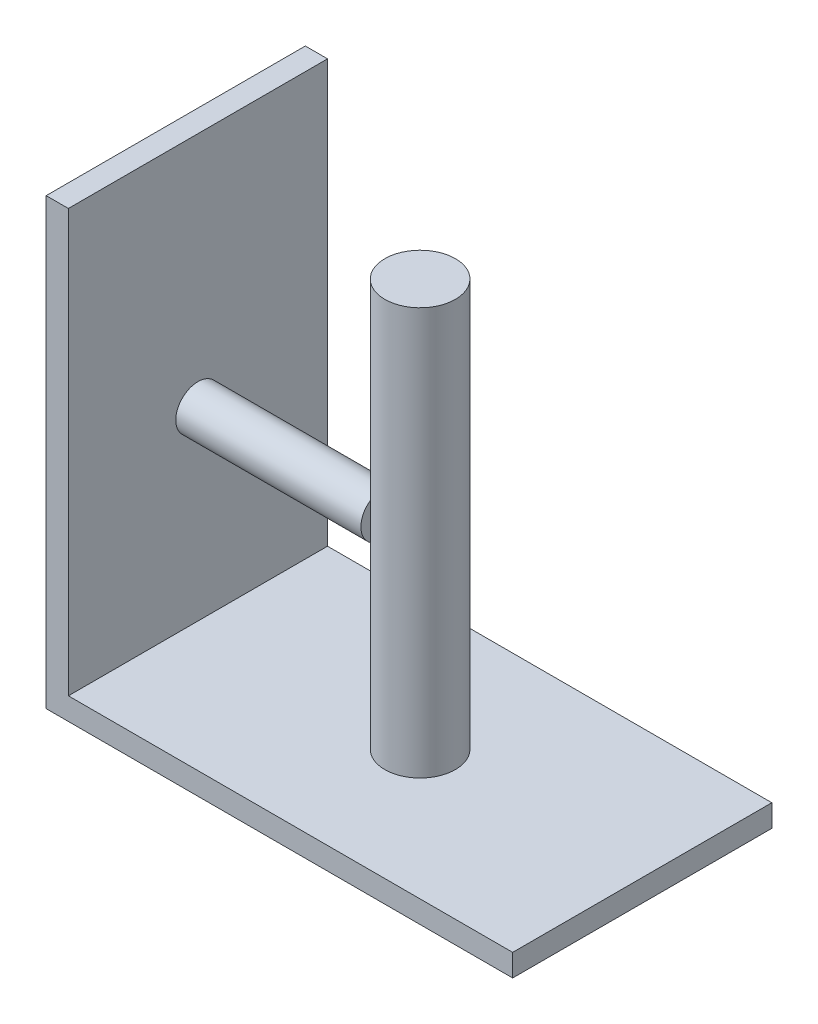
ISO-10303-21;
HEADER;
FILE_DESCRIPTION(('STEP AP214'),'2;1');
FILE_NAME('part.step','',(''),(''),'','','');
FILE_SCHEMA(('AUTOMOTIVE_DESIGN { 1 0 10303 214 1 1 1 1 }'));
ENDSEC;
DATA;
#1=APPLICATION_CONTEXT('core data for automotive mechanical design processes');
#2=APPLICATION_PROTOCOL_DEFINITION('international standard','automotive_design',2000,#1);
#3=PRODUCT_CONTEXT('',#1,'mechanical');
#4=PRODUCT('Part','Part','',(#3));
#5=PRODUCT_RELATED_PRODUCT_CATEGORY('part','',(#4));
#6=PRODUCT_DEFINITION_FORMATION('','',#4);
#7=PRODUCT_DEFINITION_CONTEXT('part definition',#1,'design');
#8=PRODUCT_DEFINITION('design','',#6,#7);
#9=PRODUCT_DEFINITION_SHAPE('','',#8);
#10=(LENGTH_UNIT() NAMED_UNIT(*) SI_UNIT(.MILLI.,.METRE.));
#11=(NAMED_UNIT(*) PLANE_ANGLE_UNIT() SI_UNIT($,.RADIAN.));
#12=(NAMED_UNIT(*) SI_UNIT($,.STERADIAN.) SOLID_ANGLE_UNIT());
#13=UNCERTAINTY_MEASURE_WITH_UNIT(LENGTH_MEASURE(1.E-05),#10,'distance_accuracy_value','');
#14=(GEOMETRIC_REPRESENTATION_CONTEXT(3) GLOBAL_UNCERTAINTY_ASSIGNED_CONTEXT((#13)) GLOBAL_UNIT_ASSIGNED_CONTEXT((#10,
#11,#12)) REPRESENTATION_CONTEXT('',''));
#15=CARTESIAN_POINT('',(0.,0.,0.));
#16=DIRECTION('',(0.,0.,1.));
#17=DIRECTION('',(1.,0.,0.));
#18=AXIS2_PLACEMENT_3D('',#15,#16,#17);
#19=CARTESIAN_POINT('',(0.,0.,17.5));
#20=DIRECTION('',(0.,0.,-1.));
#21=DIRECTION('',(-1.,0.,0.));
#22=AXIS2_PLACEMENT_3D('',#19,#20,#21);
#23=PLANE('',#22);
#24=DIRECTION('',(0.,1.,0.));
#25=VECTOR('',#24,1.);
#26=CARTESIAN_POINT('',(0.,0.,17.5));
#27=LINE('',#26,#25);
#28=CARTESIAN_POINT('',(0.,-3.,17.5));
#29=VERTEX_POINT('',#28);
#30=CARTESIAN_POINT('',(0.,57.,17.5));
#31=VERTEX_POINT('',#30);
#32=EDGE_CURVE('E125',#29,#31,#27,.T.);
#33=ORIENTED_EDGE('',*,*,#32,.F.);
#34=DIRECTION('',(1.,0.,0.));
#35=VECTOR('',#34,1.);
#36=CARTESIAN_POINT('',(0.,-3.,17.5));
#37=LINE('',#36,#35);
#38=CARTESIAN_POINT('',(63.,-3.,17.5));
#39=VERTEX_POINT('',#38);
#40=EDGE_CURVE('E96',#29,#39,#37,.T.);
#41=ORIENTED_EDGE('',*,*,#40,.T.);
#42=DIRECTION('',(0.,-1.,0.));
#43=VECTOR('',#42,1.);
#44=CARTESIAN_POINT('',(63.,0.,17.5));
#45=LINE('',#44,#43);
#46=CARTESIAN_POINT('',(63.,0.,17.5));
#47=VERTEX_POINT('',#46);
#48=EDGE_CURVE('E132',#47,#39,#45,.T.);
#49=ORIENTED_EDGE('',*,*,#48,.F.);
#50=DIRECTION('',(1.,0.,0.));
#51=VECTOR('',#50,1.);
#52=CARTESIAN_POINT('',(0.,0.,17.5));
#53=LINE('',#52,#51);
#54=CARTESIAN_POINT('',(3.,0.,17.5));
#55=VERTEX_POINT('',#54);
#56=EDGE_CURVE('E101',#55,#47,#53,.T.);
#57=ORIENTED_EDGE('',*,*,#56,.F.);
#58=DIRECTION('',(0.,1.,0.));
#59=VECTOR('',#58,1.);
#60=CARTESIAN_POINT('',(3.,0.,17.5));
#61=LINE('',#60,#59);
#62=CARTESIAN_POINT('',(3.,57.,17.5));
#63=VERTEX_POINT('',#62);
#64=EDGE_CURVE('E121',#55,#63,#61,.T.);
#65=ORIENTED_EDGE('',*,*,#64,.T.);
#66=DIRECTION('',(1.,0.,0.));
#67=VECTOR('',#66,1.);
#68=CARTESIAN_POINT('',(0.,57.,17.5));
#69=LINE('',#68,#67);
#70=EDGE_CURVE('E173',#31,#63,#69,.T.);
#71=ORIENTED_EDGE('',*,*,#70,.F.);
#72=EDGE_LOOP('',(#33,#41,#49,#57,#65,#71));
#73=FACE_BOUND('',#72,.T.);
#74=ADVANCED_FACE('F34',(#73),#23,.F.);
#75=CARTESIAN_POINT('',(0.,57.,17.5));
#76=DIRECTION('',(0.,1.,0.));
#77=DIRECTION('',(0.,0.,1.));
#78=AXIS2_PLACEMENT_3D('',#75,#76,#77);
#79=PLANE('',#78);
#80=DIRECTION('',(1.,0.,0.));
#81=VECTOR('',#80,1.);
#82=CARTESIAN_POINT('',(0.,57.,-17.5));
#83=LINE('',#82,#81);
#84=CARTESIAN_POINT('',(0.,57.,-17.5));
#85=VERTEX_POINT('',#84);
#86=CARTESIAN_POINT('',(3.,57.,-17.5));
#87=VERTEX_POINT('',#86);
#88=EDGE_CURVE('E117',#85,#87,#83,.T.);
#89=ORIENTED_EDGE('',*,*,#88,.F.);
#90=DIRECTION('',(0.,0.,-1.));
#91=VECTOR('',#90,1.);
#92=CARTESIAN_POINT('',(0.,57.,17.5));
#93=LINE('',#92,#91);
#94=EDGE_CURVE('E129',#31,#85,#93,.T.);
#95=ORIENTED_EDGE('',*,*,#94,.F.);
#96=ORIENTED_EDGE('',*,*,#70,.T.);
#97=DIRECTION('',(0.,0.,-1.));
#98=VECTOR('',#97,1.);
#99=CARTESIAN_POINT('',(3.,57.,17.5));
#100=LINE('',#99,#98);
#101=EDGE_CURVE('E127',#63,#87,#100,.T.);
#102=ORIENTED_EDGE('',*,*,#101,.T.);
#103=EDGE_LOOP('',(#89,#95,#96,#102));
#104=FACE_BOUND('',#103,.T.);
#105=ADVANCED_FACE('F151',(#104),#79,.T.);
#106=CARTESIAN_POINT('',(0.,0.,-17.5));
#107=DIRECTION('',(0.,0.,-1.));
#108=DIRECTION('',(-1.,0.,0.));
#109=AXIS2_PLACEMENT_3D('',#106,#107,#108);
#110=PLANE('',#109);
#111=DIRECTION('',(0.,1.,0.));
#112=VECTOR('',#111,1.);
#113=CARTESIAN_POINT('',(0.,0.,-17.5));
#114=LINE('',#113,#112);
#115=CARTESIAN_POINT('',(0.,-3.,-17.5));
#116=VERTEX_POINT('',#115);
#117=EDGE_CURVE('E113',#116,#85,#114,.T.);
#118=ORIENTED_EDGE('',*,*,#117,.T.);
#119=ORIENTED_EDGE('',*,*,#88,.T.);
#120=DIRECTION('',(0.,1.,0.));
#121=VECTOR('',#120,1.);
#122=CARTESIAN_POINT('',(3.,0.,-17.5));
#123=LINE('',#122,#121);
#124=CARTESIAN_POINT('',(3.,0.,-17.5));
#125=VERTEX_POINT('',#124);
#126=EDGE_CURVE('E95',#125,#87,#123,.T.);
#127=ORIENTED_EDGE('',*,*,#126,.F.);
#128=DIRECTION('',(1.,0.,0.));
#129=VECTOR('',#128,1.);
#130=CARTESIAN_POINT('',(0.,0.,-17.5));
#131=LINE('',#130,#129);
#132=CARTESIAN_POINT('',(63.,0.,-17.5));
#133=VERTEX_POINT('',#132);
#134=EDGE_CURVE('E87',#125,#133,#131,.T.);
#135=ORIENTED_EDGE('',*,*,#134,.T.);
#136=DIRECTION('',(0.,-1.,0.));
#137=VECTOR('',#136,1.);
#138=CARTESIAN_POINT('',(63.,0.,-17.5));
#139=LINE('',#138,#137);
#140=CARTESIAN_POINT('',(63.,-3.,-17.5));
#141=VERTEX_POINT('',#140);
#142=EDGE_CURVE('E92',#133,#141,#139,.T.);
#143=ORIENTED_EDGE('',*,*,#142,.T.);
#144=DIRECTION('',(1.,0.,0.));
#145=VECTOR('',#144,1.);
#146=CARTESIAN_POINT('',(0.,-3.,-17.5));
#147=LINE('',#146,#145);
#148=EDGE_CURVE('E105',#116,#141,#147,.T.);
#149=ORIENTED_EDGE('',*,*,#148,.F.);
#150=EDGE_LOOP('',(#118,#119,#127,#135,#143,#149));
#151=FACE_BOUND('',#150,.T.);
#152=ADVANCED_FACE('F90',(#151),#110,.T.);
#153=CARTESIAN_POINT('',(3.,0.,17.5));
#154=DIRECTION('',(-1.,0.,0.));
#155=DIRECTION('',(0.,0.,1.));
#156=AXIS2_PLACEMENT_3D('',#153,#154,#155);
#157=PLANE('',#156);
#158=CARTESIAN_POINT('',(3.,25.,0.));
#159=DIRECTION('',(-1.,0.,0.));
#160=DIRECTION('',(0.,0.,1.));
#161=AXIS2_PLACEMENT_3D('',#158,#159,#160);
#162=CIRCLE('',#161,3.);
#163=CARTESIAN_POINT('',(3.,25.,3.));
#164=VERTEX_POINT('',#163);
#165=EDGE_CURVE('E11',#164,#164,#162,.F.);
#166=ORIENTED_EDGE('',*,*,#165,.F.);
#167=EDGE_LOOP('',(#166));
#168=FACE_BOUND('',#167,.T.);
#169=ORIENTED_EDGE('',*,*,#126,.T.);
#170=ORIENTED_EDGE('',*,*,#101,.F.);
#171=ORIENTED_EDGE('',*,*,#64,.F.);
#172=DIRECTION('',(0.,0.,-1.));
#173=VECTOR('',#172,1.);
#174=CARTESIAN_POINT('',(3.,0.,17.5));
#175=LINE('',#174,#173);
#176=EDGE_CURVE('E43',#55,#125,#175,.T.);
#177=ORIENTED_EDGE('',*,*,#176,.T.);
#178=EDGE_LOOP('',(#169,#170,#171,#177));
#179=FACE_BOUND('',#178,.T.);
#180=ADVANCED_FACE('F144',(#168,#179),#157,.F.);
#181=CARTESIAN_POINT('',(0.,0.,17.5));
#182=DIRECTION('',(-1.,0.,0.));
#183=DIRECTION('',(0.,0.,1.));
#184=AXIS2_PLACEMENT_3D('',#181,#182,#183);
#185=PLANE('',#184);
#186=ORIENTED_EDGE('',*,*,#117,.F.);
#187=DIRECTION('',(0.,0.,-1.));
#188=VECTOR('',#187,1.);
#189=CARTESIAN_POINT('',(0.,-3.,17.5));
#190=LINE('',#189,#188);
#191=EDGE_CURVE('E111',#29,#116,#190,.T.);
#192=ORIENTED_EDGE('',*,*,#191,.F.);
#193=ORIENTED_EDGE('',*,*,#32,.T.);
#194=ORIENTED_EDGE('',*,*,#94,.T.);
#195=EDGE_LOOP('',(#186,#192,#193,#194));
#196=FACE_BOUND('',#195,.T.);
#197=ADVANCED_FACE('F138',(#196),#185,.T.);
#198=CARTESIAN_POINT('',(0.,-3.,17.5));
#199=DIRECTION('',(0.,1.,0.));
#200=DIRECTION('',(0.,0.,1.));
#201=AXIS2_PLACEMENT_3D('',#198,#199,#200);
#202=PLANE('',#201);
#203=ORIENTED_EDGE('',*,*,#148,.T.);
#204=DIRECTION('',(0.,0.,-1.));
#205=VECTOR('',#204,1.);
#206=CARTESIAN_POINT('',(63.,-3.,17.5));
#207=LINE('',#206,#205);
#208=EDGE_CURVE('E81',#39,#141,#207,.T.);
#209=ORIENTED_EDGE('',*,*,#208,.F.);
#210=ORIENTED_EDGE('',*,*,#40,.F.);
#211=ORIENTED_EDGE('',*,*,#191,.T.);
#212=EDGE_LOOP('',(#203,#209,#210,#211));
#213=FACE_BOUND('',#212,.T.);
#214=ADVANCED_FACE('F36',(#213),#202,.F.);
#215=CARTESIAN_POINT('',(63.,0.,17.5));
#216=DIRECTION('',(1.,0.,0.));
#217=DIRECTION('',(0.,0.,-1.));
#218=AXIS2_PLACEMENT_3D('',#215,#216,#217);
#219=PLANE('',#218);
#220=ORIENTED_EDGE('',*,*,#142,.F.);
#221=DIRECTION('',(0.,0.,-1.));
#222=VECTOR('',#221,1.);
#223=CARTESIAN_POINT('',(63.,0.,17.5));
#224=LINE('',#223,#222);
#225=EDGE_CURVE('E99',#47,#133,#224,.T.);
#226=ORIENTED_EDGE('',*,*,#225,.F.);
#227=ORIENTED_EDGE('',*,*,#48,.T.);
#228=ORIENTED_EDGE('',*,*,#208,.T.);
#229=EDGE_LOOP('',(#220,#226,#227,#228));
#230=FACE_BOUND('',#229,.T.);
#231=ADVANCED_FACE('F104',(#230),#219,.T.);
#232=CARTESIAN_POINT('',(0.,0.,17.5));
#233=DIRECTION('',(0.,1.,0.));
#234=DIRECTION('',(0.,0.,1.));
#235=AXIS2_PLACEMENT_3D('',#232,#233,#234);
#236=PLANE('',#235);
#237=CARTESIAN_POINT('',(33.,0.,0.));
#238=DIRECTION('',(0.,1.,0.));
#239=DIRECTION('',(0.,0.,1.));
#240=AXIS2_PLACEMENT_3D('',#237,#238,#239);
#241=CIRCLE('',#240,4.7625);
#242=CARTESIAN_POINT('',(33.,0.,4.7625));
#243=VERTEX_POINT('',#242);
#244=EDGE_CURVE('E179',#243,#243,#241,.T.);
#245=ORIENTED_EDGE('',*,*,#244,.F.);
#246=EDGE_LOOP('',(#245));
#247=FACE_BOUND('',#246,.T.);
#248=ORIENTED_EDGE('',*,*,#176,.F.);
#249=ORIENTED_EDGE('',*,*,#56,.T.);
#250=ORIENTED_EDGE('',*,*,#225,.T.);
#251=ORIENTED_EDGE('',*,*,#134,.F.);
#252=EDGE_LOOP('',(#248,#249,#250,#251));
#253=FACE_BOUND('',#252,.T.);
#254=ADVANCED_FACE('F100',(#247,#253),#236,.T.);
#255=CARTESIAN_POINT('',(28.,25.,0.));
#256=DIRECTION('',(-1.,0.,0.));
#257=DIRECTION('',(0.,0.,1.));
#258=AXIS2_PLACEMENT_3D('',#255,#256,#257);
#259=CYLINDRICAL_SURFACE('',#258,3.);
#260=CARTESIAN_POINT('',(28.,25.,0.));
#261=DIRECTION('',(1.,0.,0.));
#262=DIRECTION('',(0.,0.,-1.));
#263=AXIS2_PLACEMENT_3D('',#260,#261,#262);
#264=CIRCLE('',#263,3.);
#265=CARTESIAN_POINT('',(28.,25.,-3.));
#266=VERTEX_POINT('',#265);
#267=EDGE_CURVE('E107',#266,#266,#264,.T.);
#268=ORIENTED_EDGE('',*,*,#267,.F.);
#269=EDGE_LOOP('',(#268));
#270=FACE_BOUND('',#269,.T.);
#271=ORIENTED_EDGE('',*,*,#165,.T.);
#272=EDGE_LOOP('',(#271));
#273=FACE_BOUND('',#272,.T.);
#274=ADVANCED_FACE('F143',(#270,#273),#259,.T.);
#275=CARTESIAN_POINT('',(28.,25.,0.));
#276=DIRECTION('',(1.,0.,0.));
#277=DIRECTION('',(0.,0.,-1.));
#278=AXIS2_PLACEMENT_3D('',#275,#276,#277);
#279=PLANE('',#278);
#280=ORIENTED_EDGE('',*,*,#267,.T.);
#281=EDGE_LOOP('',(#280));
#282=FACE_BOUND('',#281,.T.);
#283=ADVANCED_FACE('F190',(#282),#279,.T.);
#284=CARTESIAN_POINT('',(33.,55.,0.));
#285=DIRECTION('',(0.,-1.,0.));
#286=DIRECTION('',(0.,0.,-1.));
#287=AXIS2_PLACEMENT_3D('',#284,#285,#286);
#288=CYLINDRICAL_SURFACE('',#287,4.7625);
#289=CARTESIAN_POINT('',(33.,55.,0.));
#290=DIRECTION('',(0.,1.,0.));
#291=DIRECTION('',(0.,0.,1.));
#292=AXIS2_PLACEMENT_3D('',#289,#290,#291);
#293=CIRCLE('',#292,4.7625);
#294=CARTESIAN_POINT('',(33.,55.,4.7625));
#295=VERTEX_POINT('',#294);
#296=EDGE_CURVE('E178',#295,#295,#293,.T.);
#297=ORIENTED_EDGE('',*,*,#296,.F.);
#298=EDGE_LOOP('',(#297));
#299=FACE_BOUND('',#298,.T.);
#300=ORIENTED_EDGE('',*,*,#244,.T.);
#301=EDGE_LOOP('',(#300));
#302=FACE_BOUND('',#301,.T.);
#303=ADVANCED_FACE('F187',(#299,#302),#288,.T.);
#304=CARTESIAN_POINT('',(33.,55.,0.));
#305=DIRECTION('',(0.,1.,0.));
#306=DIRECTION('',(0.,0.,1.));
#307=AXIS2_PLACEMENT_3D('',#304,#305,#306);
#308=PLANE('',#307);
#309=ORIENTED_EDGE('',*,*,#296,.T.);
#310=EDGE_LOOP('',(#309));
#311=FACE_BOUND('',#310,.T.);
#312=ADVANCED_FACE('F185',(#311),#308,.T.);
#313=CLOSED_SHELL('',(#74,#105,#152,#180,#197,#214,#231,#254,#274,#283,#303,#312));
#314=MANIFOLD_SOLID_BREP('B2',#313);
#315=ADVANCED_BREP_SHAPE_REPRESENTATION('',(#18,#314),#14);
#316=SHAPE_DEFINITION_REPRESENTATION(#9,#315);
ENDSEC;
END-ISO-10303-21;
